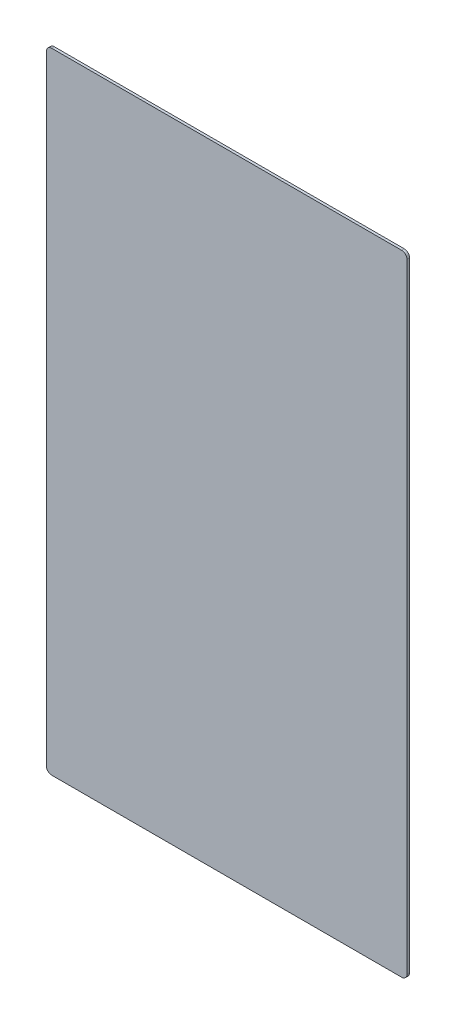
ISO-10303-21;
HEADER;
FILE_DESCRIPTION(('STEP AP214'),'2;1');
FILE_NAME('part.step','',(''),(''),'','','');
FILE_SCHEMA(('AUTOMOTIVE_DESIGN { 1 0 10303 214 1 1 1 1 }'));
ENDSEC;
DATA;
#1=APPLICATION_CONTEXT('core data for automotive mechanical design processes');
#2=APPLICATION_PROTOCOL_DEFINITION('international standard','automotive_design',2000,#1);
#3=PRODUCT_CONTEXT('',#1,'mechanical');
#4=PRODUCT('Part','Part','',(#3));
#5=PRODUCT_RELATED_PRODUCT_CATEGORY('part','',(#4));
#6=PRODUCT_DEFINITION_FORMATION('','',#4);
#7=PRODUCT_DEFINITION_CONTEXT('part definition',#1,'design');
#8=PRODUCT_DEFINITION('design','',#6,#7);
#9=PRODUCT_DEFINITION_SHAPE('','',#8);
#10=(LENGTH_UNIT() NAMED_UNIT(*) SI_UNIT(.MILLI.,.METRE.));
#11=(NAMED_UNIT(*) PLANE_ANGLE_UNIT() SI_UNIT($,.RADIAN.));
#12=(NAMED_UNIT(*) SI_UNIT($,.STERADIAN.) SOLID_ANGLE_UNIT());
#13=UNCERTAINTY_MEASURE_WITH_UNIT(LENGTH_MEASURE(1.E-05),#10,'distance_accuracy_value','');
#14=(GEOMETRIC_REPRESENTATION_CONTEXT(3) GLOBAL_UNCERTAINTY_ASSIGNED_CONTEXT((#13)) GLOBAL_UNIT_ASSIGNED_CONTEXT((#10,
#11,#12)) REPRESENTATION_CONTEXT('',''));
#15=CARTESIAN_POINT('',(0.,0.,0.));
#16=DIRECTION('',(0.,0.,1.));
#17=DIRECTION('',(1.,0.,0.));
#18=AXIS2_PLACEMENT_3D('',#15,#16,#17);
#19=CARTESIAN_POINT('',(345.,-602.5,5.));
#20=DIRECTION('',(-1.,0.,0.));
#21=DIRECTION('',(0.,0.,1.));
#22=AXIS2_PLACEMENT_3D('',#19,#20,#21);
#23=PLANE('',#22);
#24=DIRECTION('',(0.,1.,0.));
#25=VECTOR('',#24,1.);
#26=CARTESIAN_POINT('',(345.,-602.5,5.));
#27=LINE('',#26,#25);
#28=CARTESIAN_POINT('',(345.,-592.5,5.));
#29=VERTEX_POINT('',#28);
#30=CARTESIAN_POINT('',(345.,592.5,5.));
#31=VERTEX_POINT('',#30);
#32=EDGE_CURVE('E134',#29,#31,#27,.T.);
#33=ORIENTED_EDGE('',*,*,#32,.F.);
#34=DIRECTION('',(0.,0.,-1.));
#35=VECTOR('',#34,1.);
#36=CARTESIAN_POINT('',(345.,-592.5,5.));
#37=LINE('',#36,#35);
#38=CARTESIAN_POINT('',(345.,-592.5,0.));
#39=VERTEX_POINT('',#38);
#40=EDGE_CURVE('E12',#29,#39,#37,.T.);
#41=ORIENTED_EDGE('',*,*,#40,.T.);
#42=DIRECTION('',(0.,1.,0.));
#43=VECTOR('',#42,1.);
#44=CARTESIAN_POINT('',(345.,-602.5,0.));
#45=LINE('',#44,#43);
#46=CARTESIAN_POINT('',(345.,592.5,0.));
#47=VERTEX_POINT('',#46);
#48=EDGE_CURVE('E136',#39,#47,#45,.T.);
#49=ORIENTED_EDGE('',*,*,#48,.T.);
#50=DIRECTION('',(0.,0.,-1.));
#51=VECTOR('',#50,1.);
#52=CARTESIAN_POINT('',(345.,592.5,5.));
#53=LINE('',#52,#51);
#54=EDGE_CURVE('E47',#47,#31,#53,.F.);
#55=ORIENTED_EDGE('',*,*,#54,.T.);
#56=EDGE_LOOP('',(#33,#41,#49,#55));
#57=FACE_BOUND('',#56,.T.);
#58=ADVANCED_FACE('F39',(#57),#23,.F.);
#59=CARTESIAN_POINT('',(-345.,602.5,5.));
#60=DIRECTION('',(0.,-1.,0.));
#61=DIRECTION('',(0.,0.,-1.));
#62=AXIS2_PLACEMENT_3D('',#59,#60,#61);
#63=PLANE('',#62);
#64=DIRECTION('',(-1.,0.,0.));
#65=VECTOR('',#64,1.);
#66=CARTESIAN_POINT('',(-345.,602.5,0.));
#67=LINE('',#66,#65);
#68=CARTESIAN_POINT('',(335.,602.5,0.));
#69=VERTEX_POINT('',#68);
#70=CARTESIAN_POINT('',(-335.,602.5,0.));
#71=VERTEX_POINT('',#70);
#72=EDGE_CURVE('E132',#69,#71,#67,.T.);
#73=ORIENTED_EDGE('',*,*,#72,.T.);
#74=DIRECTION('',(0.,0.,-1.));
#75=VECTOR('',#74,1.);
#76=CARTESIAN_POINT('',(-335.,602.5,5.));
#77=LINE('',#76,#75);
#78=CARTESIAN_POINT('',(-335.,602.5,5.));
#79=VERTEX_POINT('',#78);
#80=EDGE_CURVE('E111',#71,#79,#77,.F.);
#81=ORIENTED_EDGE('',*,*,#80,.T.);
#82=DIRECTION('',(-1.,0.,0.));
#83=VECTOR('',#82,1.);
#84=CARTESIAN_POINT('',(-345.,602.5,5.));
#85=LINE('',#84,#83);
#86=CARTESIAN_POINT('',(335.,602.5,5.));
#87=VERTEX_POINT('',#86);
#88=EDGE_CURVE('E177',#87,#79,#85,.T.);
#89=ORIENTED_EDGE('',*,*,#88,.F.);
#90=DIRECTION('',(0.,0.,-1.));
#91=VECTOR('',#90,1.);
#92=CARTESIAN_POINT('',(335.,602.5,5.));
#93=LINE('',#92,#91);
#94=EDGE_CURVE('E116',#87,#69,#93,.T.);
#95=ORIENTED_EDGE('',*,*,#94,.T.);
#96=EDGE_LOOP('',(#73,#81,#89,#95));
#97=FACE_BOUND('',#96,.T.);
#98=ADVANCED_FACE('F180',(#97),#63,.F.);
#99=CARTESIAN_POINT('',(-345.,-602.5,5.));
#100=DIRECTION('',(1.,0.,0.));
#101=DIRECTION('',(0.,0.,-1.));
#102=AXIS2_PLACEMENT_3D('',#99,#100,#101);
#103=PLANE('',#102);
#104=DIRECTION('',(0.,-1.,0.));
#105=VECTOR('',#104,1.);
#106=CARTESIAN_POINT('',(-345.,-602.5,5.));
#107=LINE('',#106,#105);
#108=CARTESIAN_POINT('',(-345.,592.5,5.));
#109=VERTEX_POINT('',#108);
#110=CARTESIAN_POINT('',(-345.,-592.5,5.));
#111=VERTEX_POINT('',#110);
#112=EDGE_CURVE('E125',#109,#111,#107,.T.);
#113=ORIENTED_EDGE('',*,*,#112,.F.);
#114=DIRECTION('',(0.,0.,-1.));
#115=VECTOR('',#114,1.);
#116=CARTESIAN_POINT('',(-345.,592.5,5.));
#117=LINE('',#116,#115);
#118=CARTESIAN_POINT('',(-345.,592.5,0.));
#119=VERTEX_POINT('',#118);
#120=EDGE_CURVE('E110',#109,#119,#117,.T.);
#121=ORIENTED_EDGE('',*,*,#120,.T.);
#122=DIRECTION('',(0.,-1.,0.));
#123=VECTOR('',#122,1.);
#124=CARTESIAN_POINT('',(-345.,-602.5,0.));
#125=LINE('',#124,#123);
#126=CARTESIAN_POINT('',(-345.,-592.5,0.));
#127=VERTEX_POINT('',#126);
#128=EDGE_CURVE('E123',#119,#127,#125,.T.);
#129=ORIENTED_EDGE('',*,*,#128,.T.);
#130=DIRECTION('',(0.,0.,-1.));
#131=VECTOR('',#130,1.);
#132=CARTESIAN_POINT('',(-345.,-592.5,5.));
#133=LINE('',#132,#131);
#134=EDGE_CURVE('E127',#127,#111,#133,.F.);
#135=ORIENTED_EDGE('',*,*,#134,.T.);
#136=EDGE_LOOP('',(#113,#121,#129,#135));
#137=FACE_BOUND('',#136,.T.);
#138=ADVANCED_FACE('F122',(#137),#103,.F.);
#139=CARTESIAN_POINT('',(-345.,-602.5,5.));
#140=DIRECTION('',(0.,1.,0.));
#141=DIRECTION('',(0.,0.,1.));
#142=AXIS2_PLACEMENT_3D('',#139,#140,#141);
#143=PLANE('',#142);
#144=DIRECTION('',(1.,0.,0.));
#145=VECTOR('',#144,1.);
#146=CARTESIAN_POINT('',(-345.,-602.5,5.));
#147=LINE('',#146,#145);
#148=CARTESIAN_POINT('',(-335.,-602.5,5.));
#149=VERTEX_POINT('',#148);
#150=CARTESIAN_POINT('',(335.,-602.5,5.));
#151=VERTEX_POINT('',#150);
#152=EDGE_CURVE('E140',#149,#151,#147,.T.);
#153=ORIENTED_EDGE('',*,*,#152,.F.);
#154=DIRECTION('',(0.,0.,-1.));
#155=VECTOR('',#154,1.);
#156=CARTESIAN_POINT('',(-335.,-602.5,5.));
#157=LINE('',#156,#155);
#158=CARTESIAN_POINT('',(-335.,-602.5,0.));
#159=VERTEX_POINT('',#158);
#160=EDGE_CURVE('E161',#149,#159,#157,.T.);
#161=ORIENTED_EDGE('',*,*,#160,.T.);
#162=DIRECTION('',(1.,0.,0.));
#163=VECTOR('',#162,1.);
#164=CARTESIAN_POINT('',(-345.,-602.5,0.));
#165=LINE('',#164,#163);
#166=CARTESIAN_POINT('',(335.,-602.5,0.));
#167=VERTEX_POINT('',#166);
#168=EDGE_CURVE('E131',#159,#167,#165,.T.);
#169=ORIENTED_EDGE('',*,*,#168,.T.);
#170=DIRECTION('',(0.,0.,-1.));
#171=VECTOR('',#170,1.);
#172=CARTESIAN_POINT('',(335.,-602.5,5.));
#173=LINE('',#172,#171);
#174=EDGE_CURVE('E54',#167,#151,#173,.F.);
#175=ORIENTED_EDGE('',*,*,#174,.T.);
#176=EDGE_LOOP('',(#153,#161,#169,#175));
#177=FACE_BOUND('',#176,.T.);
#178=ADVANCED_FACE('F196',(#177),#143,.F.);
#179=CARTESIAN_POINT('',(0.,0.,5.));
#180=DIRECTION('',(0.,0.,-1.));
#181=DIRECTION('',(-1.,0.,0.));
#182=AXIS2_PLACEMENT_3D('',#179,#180,#181);
#183=PLANE('',#182);
#184=ORIENTED_EDGE('',*,*,#88,.T.);
#185=CARTESIAN_POINT('',(-335.,592.5,5.));
#186=DIRECTION('',(0.,0.,-1.));
#187=DIRECTION('',(-1.,0.,0.));
#188=AXIS2_PLACEMENT_3D('',#185,#186,#187);
#189=CIRCLE('',#188,10.);
#190=EDGE_CURVE('E157',#79,#109,#189,.F.);
#191=ORIENTED_EDGE('',*,*,#190,.T.);
#192=ORIENTED_EDGE('',*,*,#112,.T.);
#193=CARTESIAN_POINT('',(-335.,-592.5,5.));
#194=DIRECTION('',(0.,0.,-1.));
#195=DIRECTION('',(-1.,0.,0.));
#196=AXIS2_PLACEMENT_3D('',#193,#194,#195);
#197=CIRCLE('',#196,10.);
#198=EDGE_CURVE('E61',#111,#149,#197,.F.);
#199=ORIENTED_EDGE('',*,*,#198,.T.);
#200=ORIENTED_EDGE('',*,*,#152,.T.);
#201=CARTESIAN_POINT('',(335.,-592.5,5.));
#202=DIRECTION('',(0.,0.,-1.));
#203=DIRECTION('',(-1.,0.,0.));
#204=AXIS2_PLACEMENT_3D('',#201,#202,#203);
#205=CIRCLE('',#204,10.);
#206=EDGE_CURVE('E152',#151,#29,#205,.F.);
#207=ORIENTED_EDGE('',*,*,#206,.T.);
#208=ORIENTED_EDGE('',*,*,#32,.T.);
#209=CARTESIAN_POINT('',(335.,592.5,5.));
#210=DIRECTION('',(0.,0.,-1.));
#211=DIRECTION('',(-1.,0.,0.));
#212=AXIS2_PLACEMENT_3D('',#209,#210,#211);
#213=CIRCLE('',#212,10.);
#214=EDGE_CURVE('E149',#31,#87,#213,.F.);
#215=ORIENTED_EDGE('',*,*,#214,.T.);
#216=EDGE_LOOP('',(#184,#191,#192,#199,#200,#207,#208,#215));
#217=FACE_BOUND('',#216,.T.);
#218=ADVANCED_FACE('F173',(#217),#183,.F.);
#219=CARTESIAN_POINT('',(0.,0.,0.));
#220=DIRECTION('',(0.,0.,-1.));
#221=DIRECTION('',(-1.,0.,0.));
#222=AXIS2_PLACEMENT_3D('',#219,#220,#221);
#223=PLANE('',#222);
#224=ORIENTED_EDGE('',*,*,#128,.F.);
#225=CARTESIAN_POINT('',(-335.,592.5,0.));
#226=DIRECTION('',(0.,0.,-1.));
#227=DIRECTION('',(-1.,0.,0.));
#228=AXIS2_PLACEMENT_3D('',#225,#226,#227);
#229=CIRCLE('',#228,10.);
#230=EDGE_CURVE('E106',#119,#71,#229,.T.);
#231=ORIENTED_EDGE('',*,*,#230,.T.);
#232=ORIENTED_EDGE('',*,*,#72,.F.);
#233=CARTESIAN_POINT('',(335.,592.5,0.));
#234=DIRECTION('',(0.,0.,-1.));
#235=DIRECTION('',(-1.,0.,0.));
#236=AXIS2_PLACEMENT_3D('',#233,#234,#235);
#237=CIRCLE('',#236,10.);
#238=EDGE_CURVE('E126',#69,#47,#237,.T.);
#239=ORIENTED_EDGE('',*,*,#238,.T.);
#240=ORIENTED_EDGE('',*,*,#48,.F.);
#241=CARTESIAN_POINT('',(335.,-592.5,0.));
#242=DIRECTION('',(0.,0.,-1.));
#243=DIRECTION('',(-1.,0.,0.));
#244=AXIS2_PLACEMENT_3D('',#241,#242,#243);
#245=CIRCLE('',#244,10.);
#246=EDGE_CURVE('E143',#39,#167,#245,.T.);
#247=ORIENTED_EDGE('',*,*,#246,.T.);
#248=ORIENTED_EDGE('',*,*,#168,.F.);
#249=CARTESIAN_POINT('',(-335.,-592.5,0.));
#250=DIRECTION('',(0.,0.,-1.));
#251=DIRECTION('',(-1.,0.,0.));
#252=AXIS2_PLACEMENT_3D('',#249,#250,#251);
#253=CIRCLE('',#252,10.);
#254=EDGE_CURVE('E117',#159,#127,#253,.T.);
#255=ORIENTED_EDGE('',*,*,#254,.T.);
#256=EDGE_LOOP('',(#224,#231,#232,#239,#240,#247,#248,#255));
#257=FACE_BOUND('',#256,.T.);
#258=ADVANCED_FACE('F129',(#257),#223,.T.);
#259=CARTESIAN_POINT('',(-335.,592.5,5.));
#260=DIRECTION('',(0.,0.,-1.));
#261=DIRECTION('',(-1.,0.,0.));
#262=AXIS2_PLACEMENT_3D('',#259,#260,#261);
#263=CYLINDRICAL_SURFACE('',#262,10.);
#264=ORIENTED_EDGE('',*,*,#190,.F.);
#265=ORIENTED_EDGE('',*,*,#80,.F.);
#266=ORIENTED_EDGE('',*,*,#230,.F.);
#267=ORIENTED_EDGE('',*,*,#120,.F.);
#268=EDGE_LOOP('',(#264,#265,#266,#267));
#269=FACE_BOUND('',#268,.T.);
#270=ADVANCED_FACE('F109',(#269),#263,.T.);
#271=CARTESIAN_POINT('',(-335.,-592.5,5.));
#272=DIRECTION('',(0.,0.,-1.));
#273=DIRECTION('',(-1.,0.,0.));
#274=AXIS2_PLACEMENT_3D('',#271,#272,#273);
#275=CYLINDRICAL_SURFACE('',#274,10.);
#276=ORIENTED_EDGE('',*,*,#198,.F.);
#277=ORIENTED_EDGE('',*,*,#134,.F.);
#278=ORIENTED_EDGE('',*,*,#254,.F.);
#279=ORIENTED_EDGE('',*,*,#160,.F.);
#280=EDGE_LOOP('',(#276,#277,#278,#279));
#281=FACE_BOUND('',#280,.T.);
#282=ADVANCED_FACE('F195',(#281),#275,.T.);
#283=CARTESIAN_POINT('',(335.,-592.5,5.));
#284=DIRECTION('',(0.,0.,-1.));
#285=DIRECTION('',(-1.,0.,0.));
#286=AXIS2_PLACEMENT_3D('',#283,#284,#285);
#287=CYLINDRICAL_SURFACE('',#286,10.);
#288=ORIENTED_EDGE('',*,*,#206,.F.);
#289=ORIENTED_EDGE('',*,*,#174,.F.);
#290=ORIENTED_EDGE('',*,*,#246,.F.);
#291=ORIENTED_EDGE('',*,*,#40,.F.);
#292=EDGE_LOOP('',(#288,#289,#290,#291));
#293=FACE_BOUND('',#292,.T.);
#294=ADVANCED_FACE('F198',(#293),#287,.T.);
#295=CARTESIAN_POINT('',(335.,592.5,5.));
#296=DIRECTION('',(0.,0.,-1.));
#297=DIRECTION('',(-1.,0.,0.));
#298=AXIS2_PLACEMENT_3D('',#295,#296,#297);
#299=CYLINDRICAL_SURFACE('',#298,10.);
#300=ORIENTED_EDGE('',*,*,#214,.F.);
#301=ORIENTED_EDGE('',*,*,#54,.F.);
#302=ORIENTED_EDGE('',*,*,#238,.F.);
#303=ORIENTED_EDGE('',*,*,#94,.F.);
#304=EDGE_LOOP('',(#300,#301,#302,#303));
#305=FACE_BOUND('',#304,.T.);
#306=ADVANCED_FACE('F41',(#305),#299,.T.);
#307=CLOSED_SHELL('',(#58,#98,#138,#178,#218,#258,#270,#282,#294,#306));
#308=MANIFOLD_SOLID_BREP('B2',#307);
#309=ADVANCED_BREP_SHAPE_REPRESENTATION('',(#18,#308),#14);
#310=SHAPE_DEFINITION_REPRESENTATION(#9,#309);
ENDSEC;
END-ISO-10303-21;
